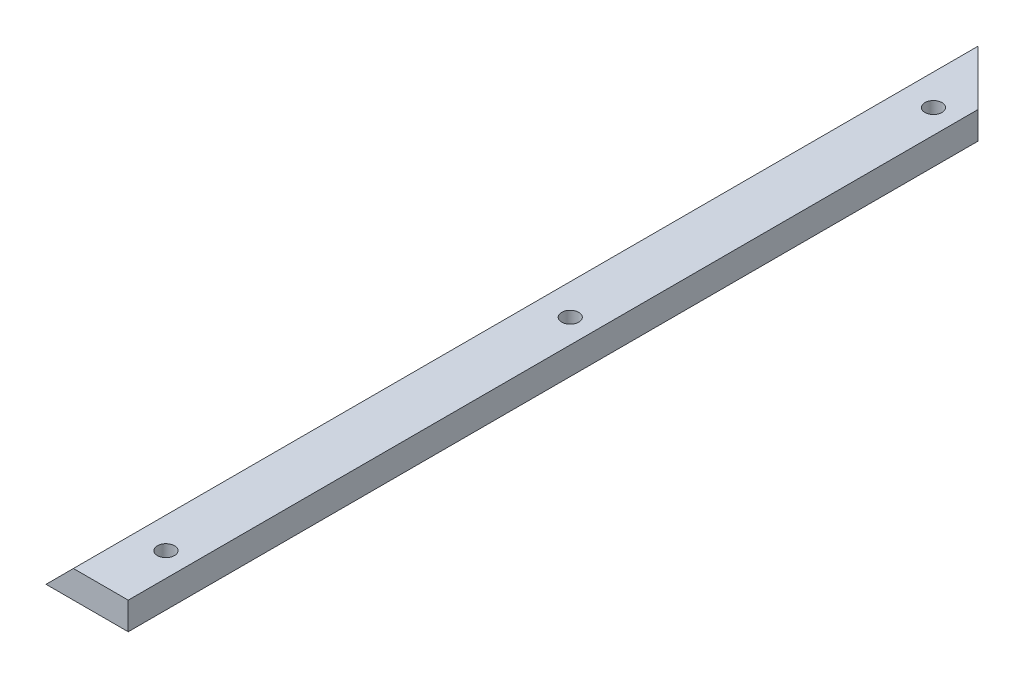
ISO-10303-21;
HEADER;
FILE_DESCRIPTION(('STEP AP214'),'2;1');
FILE_NAME('part.step','',(''),(''),'','','');
FILE_SCHEMA(('AUTOMOTIVE_DESIGN { 1 0 10303 214 1 1 1 1 }'));
ENDSEC;
DATA;
#1=APPLICATION_CONTEXT('core data for automotive mechanical design processes');
#2=APPLICATION_PROTOCOL_DEFINITION('international standard','automotive_design',2000,#1);
#3=PRODUCT_CONTEXT('',#1,'mechanical');
#4=PRODUCT('Part','Part','',(#3));
#5=PRODUCT_RELATED_PRODUCT_CATEGORY('part','',(#4));
#6=PRODUCT_DEFINITION_FORMATION('','',#4);
#7=PRODUCT_DEFINITION_CONTEXT('part definition',#1,'design');
#8=PRODUCT_DEFINITION('design','',#6,#7);
#9=PRODUCT_DEFINITION_SHAPE('','',#8);
#10=(LENGTH_UNIT() NAMED_UNIT(*) SI_UNIT(.MILLI.,.METRE.));
#11=(NAMED_UNIT(*) PLANE_ANGLE_UNIT() SI_UNIT($,.RADIAN.));
#12=(NAMED_UNIT(*) SI_UNIT($,.STERADIAN.) SOLID_ANGLE_UNIT());
#13=UNCERTAINTY_MEASURE_WITH_UNIT(LENGTH_MEASURE(1.E-05),#10,'distance_accuracy_value','');
#14=(GEOMETRIC_REPRESENTATION_CONTEXT(3) GLOBAL_UNCERTAINTY_ASSIGNED_CONTEXT((#13)) GLOBAL_UNIT_ASSIGNED_CONTEXT((#10,
#11,#12)) REPRESENTATION_CONTEXT('',''));
#15=CARTESIAN_POINT('',(0.,0.,0.));
#16=DIRECTION('',(0.,0.,1.));
#17=DIRECTION('',(1.,0.,0.));
#18=AXIS2_PLACEMENT_3D('',#15,#16,#17);
#19=CARTESIAN_POINT('',(19.05,-6.35,215.9));
#20=DIRECTION('',(-1.,0.,0.));
#21=DIRECTION('',(0.,0.,1.));
#22=AXIS2_PLACEMENT_3D('',#19,#20,#21);
#23=PLANE('',#22);
#24=DIRECTION('',(0.,0.,-1.));
#25=VECTOR('',#24,1.);
#26=CARTESIAN_POINT('',(19.05,-6.35,215.9));
#27=LINE('',#26,#25);
#28=CARTESIAN_POINT('',(19.05,-6.35,215.9));
#29=VERTEX_POINT('',#28);
#30=CARTESIAN_POINT('',(19.05,-6.35,-177.8));
#31=VERTEX_POINT('',#30);
#32=EDGE_CURVE('E90',#29,#31,#27,.T.);
#33=ORIENTED_EDGE('',*,*,#32,.T.);
#34=DIRECTION('',(0.,1.,0.));
#35=VECTOR('',#34,1.);
#36=CARTESIAN_POINT('',(19.05,-6.35,-177.8));
#37=LINE('',#36,#35);
#38=CARTESIAN_POINT('',(19.05,6.35,-177.8));
#39=VERTEX_POINT('',#38);
#40=EDGE_CURVE('E46',#31,#39,#37,.T.);
#41=ORIENTED_EDGE('',*,*,#40,.T.);
#42=DIRECTION('',(0.,0.,-1.));
#43=VECTOR('',#42,1.);
#44=CARTESIAN_POINT('',(19.05,6.35,215.9));
#45=LINE('',#44,#43);
#46=CARTESIAN_POINT('',(19.05,6.35,215.9));
#47=VERTEX_POINT('',#46);
#48=EDGE_CURVE('E11',#47,#39,#45,.T.);
#49=ORIENTED_EDGE('',*,*,#48,.F.);
#50=DIRECTION('',(0.,1.,0.));
#51=VECTOR('',#50,1.);
#52=CARTESIAN_POINT('',(19.05,-6.35,215.9));
#53=LINE('',#52,#51);
#54=EDGE_CURVE('E87',#29,#47,#53,.T.);
#55=ORIENTED_EDGE('',*,*,#54,.F.);
#56=EDGE_LOOP('',(#33,#41,#49,#55));
#57=FACE_BOUND('',#56,.T.);
#58=ADVANCED_FACE('F32',(#57),#23,.F.);
#59=CARTESIAN_POINT('',(-6.35000000000005,6.35,215.9));
#60=DIRECTION('',(0.,-1.,0.));
#61=DIRECTION('',(0.,0.,-1.));
#62=AXIS2_PLACEMENT_3D('',#59,#60,#61);
#63=PLANE('',#62);
#64=CARTESIAN_POINT('',(7.9375,6.35,0.));
#65=DIRECTION('',(0.,1.,0.));
#66=DIRECTION('',(0.,0.,1.));
#67=AXIS2_PLACEMENT_3D('',#64,#65,#66);
#68=CIRCLE('',#67,3.96874999999999);
#69=CARTESIAN_POINT('',(7.9375,6.35,3.96874999999999));
#70=VERTEX_POINT('',#69);
#71=EDGE_CURVE('E117',#70,#70,#68,.T.);
#72=ORIENTED_EDGE('',*,*,#71,.F.);
#73=EDGE_LOOP('',(#72));
#74=FACE_BOUND('',#73,.T.);
#75=CARTESIAN_POINT('',(7.9375,6.35,187.325));
#76=DIRECTION('',(0.,1.,0.));
#77=DIRECTION('',(0.,0.,1.));
#78=AXIS2_PLACEMENT_3D('',#75,#76,#77);
#79=CIRCLE('',#78,3.96874999999999);
#80=CARTESIAN_POINT('',(7.9375,6.35,191.29375));
#81=VERTEX_POINT('',#80);
#82=EDGE_CURVE('E111',#81,#81,#79,.T.);
#83=ORIENTED_EDGE('',*,*,#82,.F.);
#84=EDGE_LOOP('',(#83));
#85=FACE_BOUND('',#84,.T.);
#86=CARTESIAN_POINT('',(7.9375,6.35,-168.275));
#87=DIRECTION('',(0.,1.,0.));
#88=DIRECTION('',(0.,0.,1.));
#89=AXIS2_PLACEMENT_3D('',#86,#87,#88);
#90=CIRCLE('',#89,3.96874999999999);
#91=CARTESIAN_POINT('',(7.9375,6.35,-164.30625));
#92=VERTEX_POINT('',#91);
#93=EDGE_CURVE('E105',#92,#92,#90,.T.);
#94=ORIENTED_EDGE('',*,*,#93,.F.);
#95=EDGE_LOOP('',(#94));
#96=FACE_BOUND('',#95,.T.);
#97=ORIENTED_EDGE('',*,*,#48,.T.);
#98=DIRECTION('',(0.707106781186548,0.,0.707106781186548));
#99=VECTOR('',#98,1.);
#100=CARTESIAN_POINT('',(-19.05,6.35,-215.9));
#101=LINE('',#100,#99);
#102=CARTESIAN_POINT('',(-6.35000000000005,6.35,-203.2));
#103=VERTEX_POINT('',#102);
#104=EDGE_CURVE('E78',#103,#39,#101,.T.);
#105=ORIENTED_EDGE('',*,*,#104,.F.);
#106=DIRECTION('',(0.,0.,-1.));
#107=VECTOR('',#106,1.);
#108=CARTESIAN_POINT('',(-6.35000000000005,6.35,215.9));
#109=LINE('',#108,#107);
#110=CARTESIAN_POINT('',(-6.35000000000005,6.35,215.9));
#111=VERTEX_POINT('',#110);
#112=EDGE_CURVE('E39',#111,#103,#109,.T.);
#113=ORIENTED_EDGE('',*,*,#112,.F.);
#114=DIRECTION('',(-1.,0.,0.));
#115=VECTOR('',#114,1.);
#116=CARTESIAN_POINT('',(-6.35000000000005,6.35,215.9));
#117=LINE('',#116,#115);
#118=EDGE_CURVE('E97',#47,#111,#117,.T.);
#119=ORIENTED_EDGE('',*,*,#118,.F.);
#120=EDGE_LOOP('',(#97,#105,#113,#119));
#121=FACE_BOUND('',#120,.T.);
#122=ADVANCED_FACE('F123',(#74,#85,#96,#121),#63,.F.);
#123=CARTESIAN_POINT('',(-19.05,-6.35,215.9));
#124=DIRECTION('',(0.707106781186549,-0.707106781186546,0.));
#125=DIRECTION('',(0.707106781186546,0.707106781186549,0.));
#126=AXIS2_PLACEMENT_3D('',#123,#124,#125);
#127=PLANE('',#126);
#128=ORIENTED_EDGE('',*,*,#112,.T.);
#129=DIRECTION('',(-0.577350269189625,-0.577350269189627,-0.577350269189625));
#130=VECTOR('',#129,1.);
#131=CARTESIAN_POINT('',(124.883333333333,137.583333333334,-71.9666666666671));
#132=LINE('',#131,#130);
#133=CARTESIAN_POINT('',(-19.05,-6.35,-215.9));
#134=VERTEX_POINT('',#133);
#135=EDGE_CURVE('E73',#103,#134,#132,.T.);
#136=ORIENTED_EDGE('',*,*,#135,.T.);
#137=DIRECTION('',(0.,0.,-1.));
#138=VECTOR('',#137,1.);
#139=CARTESIAN_POINT('',(-19.05,-6.35,215.9));
#140=LINE('',#139,#138);
#141=CARTESIAN_POINT('',(-19.05,-6.35,215.9));
#142=VERTEX_POINT('',#141);
#143=EDGE_CURVE('E85',#142,#134,#140,.T.);
#144=ORIENTED_EDGE('',*,*,#143,.F.);
#145=DIRECTION('',(-0.707106781186546,-0.707106781186549,0.));
#146=VECTOR('',#145,1.);
#147=CARTESIAN_POINT('',(-19.05,-6.35,215.9));
#148=LINE('',#147,#146);
#149=EDGE_CURVE('E95',#111,#142,#148,.T.);
#150=ORIENTED_EDGE('',*,*,#149,.F.);
#151=EDGE_LOOP('',(#128,#136,#144,#150));
#152=FACE_BOUND('',#151,.T.);
#153=ADVANCED_FACE('F83',(#152),#127,.F.);
#154=CARTESIAN_POINT('',(-19.05,-6.35,215.9));
#155=DIRECTION('',(0.,1.,0.));
#156=DIRECTION('',(0.,0.,1.));
#157=AXIS2_PLACEMENT_3D('',#154,#155,#156);
#158=PLANE('',#157);
#159=CARTESIAN_POINT('',(7.9375,-6.35000000000001,0.));
#160=DIRECTION('',(0.,1.,0.));
#161=DIRECTION('',(0.,0.,1.));
#162=AXIS2_PLACEMENT_3D('',#159,#160,#161);
#163=CIRCLE('',#162,3.96874999999999);
#164=CARTESIAN_POINT('',(7.9375,-6.35000000000001,3.96874999999999));
#165=VERTEX_POINT('',#164);
#166=EDGE_CURVE('E114',#165,#165,#163,.T.);
#167=ORIENTED_EDGE('',*,*,#166,.T.);
#168=EDGE_LOOP('',(#167));
#169=FACE_BOUND('',#168,.T.);
#170=CARTESIAN_POINT('',(7.9375,-6.35000000000001,187.325));
#171=DIRECTION('',(0.,1.,0.));
#172=DIRECTION('',(0.,0.,1.));
#173=AXIS2_PLACEMENT_3D('',#170,#171,#172);
#174=CIRCLE('',#173,3.96874999999999);
#175=CARTESIAN_POINT('',(7.9375,-6.35000000000001,191.29375));
#176=VERTEX_POINT('',#175);
#177=EDGE_CURVE('E108',#176,#176,#174,.T.);
#178=ORIENTED_EDGE('',*,*,#177,.T.);
#179=EDGE_LOOP('',(#178));
#180=FACE_BOUND('',#179,.T.);
#181=CARTESIAN_POINT('',(7.9375,-6.35000000000001,-168.275));
#182=DIRECTION('',(0.,1.,0.));
#183=DIRECTION('',(0.,0.,1.));
#184=AXIS2_PLACEMENT_3D('',#181,#182,#183);
#185=CIRCLE('',#184,3.96874999999999);
#186=CARTESIAN_POINT('',(7.9375,-6.35000000000001,-164.30625));
#187=VERTEX_POINT('',#186);
#188=EDGE_CURVE('E101',#187,#187,#185,.T.);
#189=ORIENTED_EDGE('',*,*,#188,.T.);
#190=EDGE_LOOP('',(#189));
#191=FACE_BOUND('',#190,.T.);
#192=ORIENTED_EDGE('',*,*,#143,.T.);
#193=DIRECTION('',(0.707106781186548,0.,0.707106781186548));
#194=VECTOR('',#193,1.);
#195=CARTESIAN_POINT('',(-19.05,-6.35,-215.9));
#196=LINE('',#195,#194);
#197=EDGE_CURVE('E70',#134,#31,#196,.T.);
#198=ORIENTED_EDGE('',*,*,#197,.T.);
#199=ORIENTED_EDGE('',*,*,#32,.F.);
#200=DIRECTION('',(1.,0.,0.));
#201=VECTOR('',#200,1.);
#202=CARTESIAN_POINT('',(-19.05,-6.35,215.9));
#203=LINE('',#202,#201);
#204=EDGE_CURVE('E54',#142,#29,#203,.T.);
#205=ORIENTED_EDGE('',*,*,#204,.F.);
#206=EDGE_LOOP('',(#192,#198,#199,#205));
#207=FACE_BOUND('',#206,.T.);
#208=ADVANCED_FACE('F89',(#169,#180,#191,#207),#158,.F.);
#209=CARTESIAN_POINT('',(0.,0.,215.9));
#210=DIRECTION('',(0.,0.,-1.));
#211=DIRECTION('',(-1.,0.,0.));
#212=AXIS2_PLACEMENT_3D('',#209,#210,#211);
#213=PLANE('',#212);
#214=ORIENTED_EDGE('',*,*,#54,.T.);
#215=ORIENTED_EDGE('',*,*,#118,.T.);
#216=ORIENTED_EDGE('',*,*,#149,.T.);
#217=ORIENTED_EDGE('',*,*,#204,.T.);
#218=EDGE_LOOP('',(#214,#215,#216,#217));
#219=FACE_BOUND('',#218,.T.);
#220=ADVANCED_FACE('F133',(#219),#213,.F.);
#221=CARTESIAN_POINT('',(-19.05,-6.35,-215.9));
#222=DIRECTION('',(-0.707106781186548,0.,0.707106781186548));
#223=DIRECTION('',(0.707106781186548,0.,0.707106781186548));
#224=AXIS2_PLACEMENT_3D('',#221,#222,#223);
#225=PLANE('',#224);
#226=ORIENTED_EDGE('',*,*,#104,.T.);
#227=ORIENTED_EDGE('',*,*,#40,.F.);
#228=ORIENTED_EDGE('',*,*,#197,.F.);
#229=ORIENTED_EDGE('',*,*,#135,.F.);
#230=EDGE_LOOP('',(#226,#227,#228,#229));
#231=FACE_BOUND('',#230,.T.);
#232=ADVANCED_FACE('F72',(#231),#225,.F.);
#233=CARTESIAN_POINT('',(7.9375,6.35,-168.275));
#234=DIRECTION('',(0.,1.,0.));
#235=DIRECTION('',(0.,0.,1.));
#236=AXIS2_PLACEMENT_3D('',#233,#234,#235);
#237=CYLINDRICAL_SURFACE('',#236,3.96874999999999);
#238=ORIENTED_EDGE('',*,*,#188,.F.);
#239=EDGE_LOOP('',(#238));
#240=FACE_BOUND('',#239,.T.);
#241=ORIENTED_EDGE('',*,*,#93,.T.);
#242=EDGE_LOOP('',(#241));
#243=FACE_BOUND('',#242,.T.);
#244=ADVANCED_FACE('F140',(#240,#243),#237,.F.);
#245=CARTESIAN_POINT('',(7.9375,6.35,187.325));
#246=DIRECTION('',(0.,1.,0.));
#247=DIRECTION('',(0.,0.,1.));
#248=AXIS2_PLACEMENT_3D('',#245,#246,#247);
#249=CYLINDRICAL_SURFACE('',#248,3.96874999999999);
#250=ORIENTED_EDGE('',*,*,#177,.F.);
#251=EDGE_LOOP('',(#250));
#252=FACE_BOUND('',#251,.T.);
#253=ORIENTED_EDGE('',*,*,#82,.T.);
#254=EDGE_LOOP('',(#253));
#255=FACE_BOUND('',#254,.T.);
#256=ADVANCED_FACE('F172',(#252,#255),#249,.F.);
#257=CARTESIAN_POINT('',(7.9375,6.35,0.));
#258=DIRECTION('',(0.,1.,0.));
#259=DIRECTION('',(0.,0.,1.));
#260=AXIS2_PLACEMENT_3D('',#257,#258,#259);
#261=CYLINDRICAL_SURFACE('',#260,3.96874999999999);
#262=ORIENTED_EDGE('',*,*,#166,.F.);
#263=EDGE_LOOP('',(#262));
#264=FACE_BOUND('',#263,.T.);
#265=ORIENTED_EDGE('',*,*,#71,.T.);
#266=EDGE_LOOP('',(#265));
#267=FACE_BOUND('',#266,.T.);
#268=ADVANCED_FACE('F121',(#264,#267),#261,.F.);
#269=CLOSED_SHELL('',(#58,#122,#153,#208,#220,#232,#244,#256,#268));
#270=MANIFOLD_SOLID_BREP('B2',#269);
#271=ADVANCED_BREP_SHAPE_REPRESENTATION('',(#18,#270),#14);
#272=SHAPE_DEFINITION_REPRESENTATION(#9,#271);
ENDSEC;
END-ISO-10303-21;
